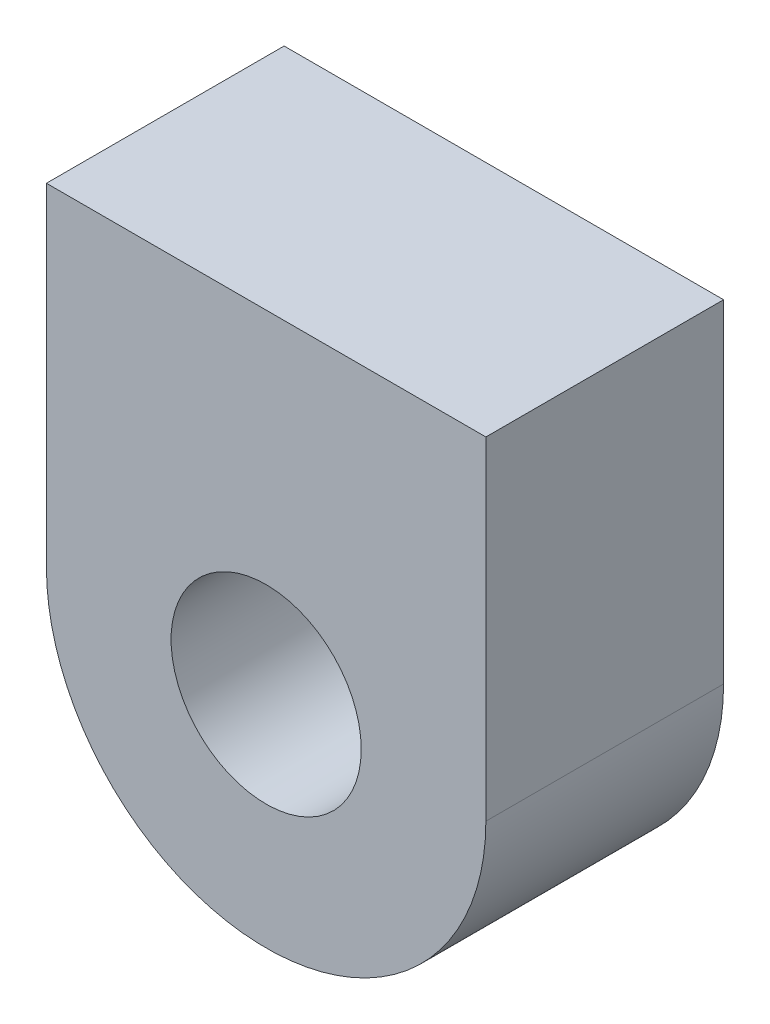
ISO-10303-21;
HEADER;
FILE_DESCRIPTION(('STEP AP214'),'2;1');
FILE_NAME('part.step','',(''),(''),'','','');
FILE_SCHEMA(('AUTOMOTIVE_DESIGN { 1 0 10303 214 1 1 1 1 }'));
ENDSEC;
DATA;
#1=APPLICATION_CONTEXT('core data for automotive mechanical design processes');
#2=APPLICATION_PROTOCOL_DEFINITION('international standard','automotive_design',2000,#1);
#3=PRODUCT_CONTEXT('',#1,'mechanical');
#4=PRODUCT('Part','Part','',(#3));
#5=PRODUCT_RELATED_PRODUCT_CATEGORY('part','',(#4));
#6=PRODUCT_DEFINITION_FORMATION('','',#4);
#7=PRODUCT_DEFINITION_CONTEXT('part definition',#1,'design');
#8=PRODUCT_DEFINITION('design','',#6,#7);
#9=PRODUCT_DEFINITION_SHAPE('','',#8);
#10=(LENGTH_UNIT() NAMED_UNIT(*) SI_UNIT(.MILLI.,.METRE.));
#11=(NAMED_UNIT(*) PLANE_ANGLE_UNIT() SI_UNIT($,.RADIAN.));
#12=(NAMED_UNIT(*) SI_UNIT($,.STERADIAN.) SOLID_ANGLE_UNIT());
#13=UNCERTAINTY_MEASURE_WITH_UNIT(LENGTH_MEASURE(1.E-05),#10,'distance_accuracy_value','');
#14=(GEOMETRIC_REPRESENTATION_CONTEXT(3) GLOBAL_UNCERTAINTY_ASSIGNED_CONTEXT((#13)) GLOBAL_UNIT_ASSIGNED_CONTEXT((#10,
#11,#12)) REPRESENTATION_CONTEXT('',''));
#15=CARTESIAN_POINT('',(0.,0.,0.));
#16=DIRECTION('',(0.,0.,1.));
#17=DIRECTION('',(1.,0.,0.));
#18=AXIS2_PLACEMENT_3D('',#15,#16,#17);
#19=CARTESIAN_POINT('',(0.,0.,5.));
#20=DIRECTION('',(0.,0.,1.));
#21=DIRECTION('',(1.,0.,0.));
#22=AXIS2_PLACEMENT_3D('',#19,#20,#21);
#23=PLANE('',#22);
#24=DIRECTION('',(-1.,0.,0.));
#25=VECTOR('',#24,1.);
#26=CARTESIAN_POINT('',(-4.6220262187524,7.,5.));
#27=LINE('',#26,#25);
#28=CARTESIAN_POINT('',(4.6220262187524,7.,5.));
#29=VERTEX_POINT('',#28);
#30=CARTESIAN_POINT('',(-4.6220262187524,7.,5.));
#31=VERTEX_POINT('',#30);
#32=EDGE_CURVE('E98',#29,#31,#27,.T.);
#33=ORIENTED_EDGE('',*,*,#32,.T.);
#34=DIRECTION('',(0.,-1.,0.));
#35=VECTOR('',#34,1.);
#36=CARTESIAN_POINT('',(-4.6220262187524,7.,5.));
#37=LINE('',#36,#35);
#38=CARTESIAN_POINT('',(-4.6220262187524,0.,5.));
#39=VERTEX_POINT('',#38);
#40=EDGE_CURVE('E93',#31,#39,#37,.T.);
#41=ORIENTED_EDGE('',*,*,#40,.T.);
#42=CARTESIAN_POINT('',(0.,0.,5.));
#43=DIRECTION('',(0.,0.,1.));
#44=DIRECTION('',(1.,0.,0.));
#45=AXIS2_PLACEMENT_3D('',#42,#43,#44);
#46=CIRCLE('',#45,4.6220262187524);
#47=CARTESIAN_POINT('',(4.6220262187524,0.,5.));
#48=VERTEX_POINT('',#47);
#49=EDGE_CURVE('E96',#39,#48,#46,.T.);
#50=ORIENTED_EDGE('',*,*,#49,.T.);
#51=DIRECTION('',(0.,1.,0.));
#52=VECTOR('',#51,1.);
#53=CARTESIAN_POINT('',(4.6220262187524,7.,5.));
#54=LINE('',#53,#52);
#55=EDGE_CURVE('E63',#48,#29,#54,.T.);
#56=ORIENTED_EDGE('',*,*,#55,.T.);
#57=EDGE_LOOP('',(#33,#41,#50,#56));
#58=FACE_BOUND('',#57,.T.);
#59=CARTESIAN_POINT('',(0.,0.,5.));
#60=DIRECTION('',(0.,0.,1.));
#61=DIRECTION('',(1.,0.,0.));
#62=AXIS2_PLACEMENT_3D('',#59,#60,#61);
#63=CIRCLE('',#62,2.);
#64=CARTESIAN_POINT('',(2.,0.,5.));
#65=VERTEX_POINT('',#64);
#66=EDGE_CURVE('E118',#65,#65,#63,.T.);
#67=ORIENTED_EDGE('',*,*,#66,.F.);
#68=EDGE_LOOP('',(#67));
#69=FACE_BOUND('',#68,.T.);
#70=ADVANCED_FACE('F45',(#58,#69),#23,.T.);
#71=CARTESIAN_POINT('',(0.,0.,0.));
#72=DIRECTION('',(0.,0.,1.));
#73=DIRECTION('',(1.,0.,0.));
#74=AXIS2_PLACEMENT_3D('',#71,#72,#73);
#75=PLANE('',#74);
#76=DIRECTION('',(-1.,0.,0.));
#77=VECTOR('',#76,1.);
#78=CARTESIAN_POINT('',(-4.6220262187524,7.,0.));
#79=LINE('',#78,#77);
#80=CARTESIAN_POINT('',(4.6220262187524,7.,0.));
#81=VERTEX_POINT('',#80);
#82=CARTESIAN_POINT('',(-4.6220262187524,7.,0.));
#83=VERTEX_POINT('',#82);
#84=EDGE_CURVE('E114',#81,#83,#79,.T.);
#85=ORIENTED_EDGE('',*,*,#84,.F.);
#86=DIRECTION('',(0.,1.,0.));
#87=VECTOR('',#86,1.);
#88=CARTESIAN_POINT('',(4.6220262187524,7.,0.));
#89=LINE('',#88,#87);
#90=CARTESIAN_POINT('',(4.6220262187524,0.,0.));
#91=VERTEX_POINT('',#90);
#92=EDGE_CURVE('E86',#91,#81,#89,.T.);
#93=ORIENTED_EDGE('',*,*,#92,.F.);
#94=CARTESIAN_POINT('',(0.,0.,0.));
#95=DIRECTION('',(0.,0.,1.));
#96=DIRECTION('',(1.,0.,0.));
#97=AXIS2_PLACEMENT_3D('',#94,#95,#96);
#98=CIRCLE('',#97,4.6220262187524);
#99=CARTESIAN_POINT('',(-4.6220262187524,0.,0.));
#100=VERTEX_POINT('',#99);
#101=EDGE_CURVE('E80',#100,#91,#98,.T.);
#102=ORIENTED_EDGE('',*,*,#101,.F.);
#103=DIRECTION('',(0.,-1.,0.));
#104=VECTOR('',#103,1.);
#105=CARTESIAN_POINT('',(-4.6220262187524,7.,0.));
#106=LINE('',#105,#104);
#107=EDGE_CURVE('E103',#83,#100,#106,.T.);
#108=ORIENTED_EDGE('',*,*,#107,.F.);
#109=EDGE_LOOP('',(#85,#93,#102,#108));
#110=FACE_BOUND('',#109,.T.);
#111=CARTESIAN_POINT('',(0.,0.,0.));
#112=DIRECTION('',(0.,0.,1.));
#113=DIRECTION('',(1.,0.,0.));
#114=AXIS2_PLACEMENT_3D('',#111,#112,#113);
#115=CIRCLE('',#114,2.);
#116=CARTESIAN_POINT('',(2.,0.,0.));
#117=VERTEX_POINT('',#116);
#118=EDGE_CURVE('E136',#117,#117,#115,.T.);
#119=ORIENTED_EDGE('',*,*,#118,.T.);
#120=EDGE_LOOP('',(#119));
#121=FACE_BOUND('',#120,.T.);
#122=ADVANCED_FACE('F131',(#110,#121),#75,.F.);
#123=CARTESIAN_POINT('',(-4.6220262187524,7.,5.));
#124=DIRECTION('',(0.,-1.,0.));
#125=DIRECTION('',(1.,0.,0.));
#126=AXIS2_PLACEMENT_3D('',#123,#124,#125);
#127=PLANE('',#126);
#128=ORIENTED_EDGE('',*,*,#84,.T.);
#129=DIRECTION('',(0.,0.,-1.));
#130=VECTOR('',#129,1.);
#131=CARTESIAN_POINT('',(-4.6220262187524,7.,5.));
#132=LINE('',#131,#130);
#133=EDGE_CURVE('E11',#31,#83,#132,.T.);
#134=ORIENTED_EDGE('',*,*,#133,.F.);
#135=ORIENTED_EDGE('',*,*,#32,.F.);
#136=DIRECTION('',(0.,0.,-1.));
#137=VECTOR('',#136,1.);
#138=CARTESIAN_POINT('',(4.6220262187524,7.,5.));
#139=LINE('',#138,#137);
#140=EDGE_CURVE('E110',#29,#81,#139,.T.);
#141=ORIENTED_EDGE('',*,*,#140,.T.);
#142=EDGE_LOOP('',(#128,#134,#135,#141));
#143=FACE_BOUND('',#142,.T.);
#144=ADVANCED_FACE('F47',(#143),#127,.F.);
#145=CARTESIAN_POINT('',(-4.6220262187524,7.,5.));
#146=DIRECTION('',(1.,0.,0.));
#147=DIRECTION('',(0.,0.,-1.));
#148=AXIS2_PLACEMENT_3D('',#145,#146,#147);
#149=PLANE('',#148);
#150=ORIENTED_EDGE('',*,*,#107,.T.);
#151=DIRECTION('',(0.,0.,-1.));
#152=VECTOR('',#151,1.);
#153=CARTESIAN_POINT('',(-4.6220262187524,0.,5.));
#154=LINE('',#153,#152);
#155=EDGE_CURVE('E55',#39,#100,#154,.T.);
#156=ORIENTED_EDGE('',*,*,#155,.F.);
#157=ORIENTED_EDGE('',*,*,#40,.F.);
#158=ORIENTED_EDGE('',*,*,#133,.T.);
#159=EDGE_LOOP('',(#150,#156,#157,#158));
#160=FACE_BOUND('',#159,.T.);
#161=ADVANCED_FACE('F102',(#160),#149,.F.);
#162=CARTESIAN_POINT('',(0.,0.,5.));
#163=DIRECTION('',(0.,0.,-1.));
#164=DIRECTION('',(-1.,0.,0.));
#165=AXIS2_PLACEMENT_3D('',#162,#163,#164);
#166=CYLINDRICAL_SURFACE('',#165,4.6220262187524);
#167=ORIENTED_EDGE('',*,*,#101,.T.);
#168=DIRECTION('',(0.,0.,-1.));
#169=VECTOR('',#168,1.);
#170=CARTESIAN_POINT('',(4.6220262187524,0.,5.));
#171=LINE('',#170,#169);
#172=EDGE_CURVE('E105',#48,#91,#171,.T.);
#173=ORIENTED_EDGE('',*,*,#172,.F.);
#174=ORIENTED_EDGE('',*,*,#49,.F.);
#175=ORIENTED_EDGE('',*,*,#155,.T.);
#176=EDGE_LOOP('',(#167,#173,#174,#175));
#177=FACE_BOUND('',#176,.T.);
#178=ADVANCED_FACE('F106',(#177),#166,.T.);
#179=CARTESIAN_POINT('',(4.6220262187524,7.,5.));
#180=DIRECTION('',(-1.,0.,0.));
#181=DIRECTION('',(0.,0.,1.));
#182=AXIS2_PLACEMENT_3D('',#179,#180,#181);
#183=PLANE('',#182);
#184=ORIENTED_EDGE('',*,*,#92,.T.);
#185=ORIENTED_EDGE('',*,*,#140,.F.);
#186=ORIENTED_EDGE('',*,*,#55,.F.);
#187=ORIENTED_EDGE('',*,*,#172,.T.);
#188=EDGE_LOOP('',(#184,#185,#186,#187));
#189=FACE_BOUND('',#188,.T.);
#190=ADVANCED_FACE('F128',(#189),#183,.F.);
#191=CARTESIAN_POINT('',(0.,0.,5.));
#192=DIRECTION('',(0.,0.,-1.));
#193=DIRECTION('',(-1.,0.,0.));
#194=AXIS2_PLACEMENT_3D('',#191,#192,#193);
#195=CYLINDRICAL_SURFACE('',#194,2.);
#196=ORIENTED_EDGE('',*,*,#66,.T.);
#197=EDGE_LOOP('',(#196));
#198=FACE_BOUND('',#197,.T.);
#199=ORIENTED_EDGE('',*,*,#118,.F.);
#200=EDGE_LOOP('',(#199));
#201=FACE_BOUND('',#200,.T.);
#202=ADVANCED_FACE('F144',(#198,#201),#195,.F.);
#203=CLOSED_SHELL('',(#70,#122,#144,#161,#178,#190,#202));
#204=MANIFOLD_SOLID_BREP('B2',#203);
#205=ADVANCED_BREP_SHAPE_REPRESENTATION('',(#18,#204),#14);
#206=SHAPE_DEFINITION_REPRESENTATION(#9,#205);
ENDSEC;
END-ISO-10303-21;
